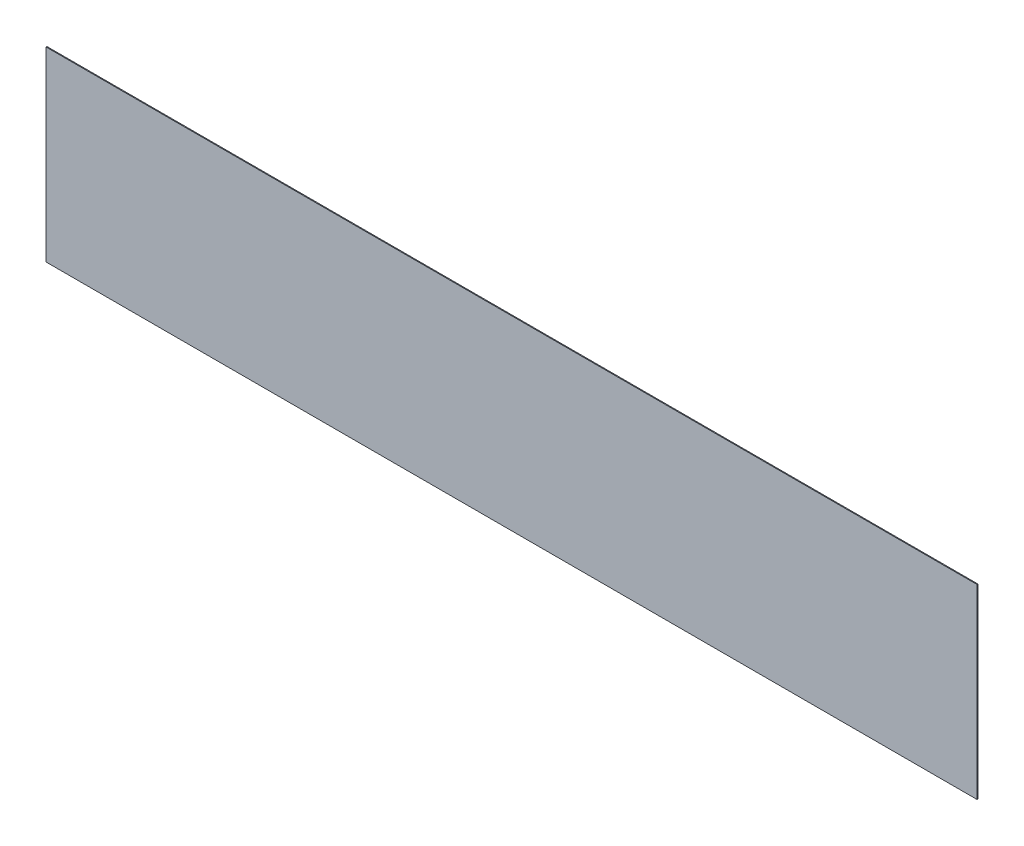
ISO-10303-21;
HEADER;
FILE_DESCRIPTION(('STEP AP214'),'2;1');
FILE_NAME('part.step','',(''),(''),'','','');
FILE_SCHEMA(('AUTOMOTIVE_DESIGN { 1 0 10303 214 1 1 1 1 }'));
ENDSEC;
DATA;
#1=APPLICATION_CONTEXT('core data for automotive mechanical design processes');
#2=APPLICATION_PROTOCOL_DEFINITION('international standard','automotive_design',2000,#1);
#3=PRODUCT_CONTEXT('',#1,'mechanical');
#4=PRODUCT('Part','Part','',(#3));
#5=PRODUCT_RELATED_PRODUCT_CATEGORY('part','',(#4));
#6=PRODUCT_DEFINITION_FORMATION('','',#4);
#7=PRODUCT_DEFINITION_CONTEXT('part definition',#1,'design');
#8=PRODUCT_DEFINITION('design','',#6,#7);
#9=PRODUCT_DEFINITION_SHAPE('','',#8);
#10=(LENGTH_UNIT() NAMED_UNIT(*) SI_UNIT(.MILLI.,.METRE.));
#11=(NAMED_UNIT(*) PLANE_ANGLE_UNIT() SI_UNIT($,.RADIAN.));
#12=(NAMED_UNIT(*) SI_UNIT($,.STERADIAN.) SOLID_ANGLE_UNIT());
#13=UNCERTAINTY_MEASURE_WITH_UNIT(LENGTH_MEASURE(1.E-05),#10,'distance_accuracy_value','');
#14=(GEOMETRIC_REPRESENTATION_CONTEXT(3) GLOBAL_UNCERTAINTY_ASSIGNED_CONTEXT((#13)) GLOBAL_UNIT_ASSIGNED_CONTEXT((#10,
#11,#12)) REPRESENTATION_CONTEXT('',''));
#15=CARTESIAN_POINT('',(0.,0.,0.));
#16=DIRECTION('',(0.,0.,1.));
#17=DIRECTION('',(1.,0.,0.));
#18=AXIS2_PLACEMENT_3D('',#15,#16,#17);
#19=CARTESIAN_POINT('',(139.996,16.,0.15));
#20=DIRECTION('',(0.,-1.,0.));
#21=DIRECTION('',(1.,0.,0.));
#22=AXIS2_PLACEMENT_3D('',#19,#20,#21);
#23=PLANE('',#22);
#24=DIRECTION('',(-1.,0.,0.));
#25=VECTOR('',#24,1.);
#26=CARTESIAN_POINT('',(139.996,16.,0.));
#27=LINE('',#26,#25);
#28=CARTESIAN_POINT('',(139.996,16.,0.));
#29=VERTEX_POINT('',#28);
#30=CARTESIAN_POINT('',(-20.,16.,0.));
#31=VERTEX_POINT('',#30);
#32=EDGE_CURVE('E100',#29,#31,#27,.T.);
#33=ORIENTED_EDGE('',*,*,#32,.T.);
#34=DIRECTION('',(0.,0.,-1.));
#35=VECTOR('',#34,1.);
#36=CARTESIAN_POINT('',(-20.,16.,0.15));
#37=LINE('',#36,#35);
#38=CARTESIAN_POINT('',(-20.,16.,0.15));
#39=VERTEX_POINT('',#38);
#40=EDGE_CURVE('E11',#39,#31,#37,.T.);
#41=ORIENTED_EDGE('',*,*,#40,.F.);
#42=DIRECTION('',(-1.,0.,0.));
#43=VECTOR('',#42,1.);
#44=CARTESIAN_POINT('',(139.996,16.,0.15));
#45=LINE('',#44,#43);
#46=CARTESIAN_POINT('',(139.996,16.,0.15));
#47=VERTEX_POINT('',#46);
#48=EDGE_CURVE('E88',#47,#39,#45,.T.);
#49=ORIENTED_EDGE('',*,*,#48,.F.);
#50=DIRECTION('',(0.,0.,-1.));
#51=VECTOR('',#50,1.);
#52=CARTESIAN_POINT('',(139.996,16.,0.15));
#53=LINE('',#52,#51);
#54=EDGE_CURVE('E96',#47,#29,#53,.T.);
#55=ORIENTED_EDGE('',*,*,#54,.T.);
#56=EDGE_LOOP('',(#33,#41,#49,#55));
#57=FACE_BOUND('',#56,.T.);
#58=ADVANCED_FACE('F37',(#57),#23,.F.);
#59=CARTESIAN_POINT('',(-20.,16.,0.15));
#60=DIRECTION('',(1.,0.,0.));
#61=DIRECTION('',(0.,0.,-1.));
#62=AXIS2_PLACEMENT_3D('',#59,#60,#61);
#63=PLANE('',#62);
#64=DIRECTION('',(0.,-1.,0.));
#65=VECTOR('',#64,1.);
#66=CARTESIAN_POINT('',(-20.,16.,0.));
#67=LINE('',#66,#65);
#68=CARTESIAN_POINT('',(-20.,-16.,0.));
#69=VERTEX_POINT('',#68);
#70=EDGE_CURVE('E92',#31,#69,#67,.T.);
#71=ORIENTED_EDGE('',*,*,#70,.T.);
#72=DIRECTION('',(0.,0.,-1.));
#73=VECTOR('',#72,1.);
#74=CARTESIAN_POINT('',(-20.,-16.,0.15));
#75=LINE('',#74,#73);
#76=CARTESIAN_POINT('',(-20.,-16.,0.15));
#77=VERTEX_POINT('',#76);
#78=EDGE_CURVE('E45',#77,#69,#75,.T.);
#79=ORIENTED_EDGE('',*,*,#78,.F.);
#80=DIRECTION('',(0.,-1.,0.));
#81=VECTOR('',#80,1.);
#82=CARTESIAN_POINT('',(-20.,16.,0.15));
#83=LINE('',#82,#81);
#84=EDGE_CURVE('E83',#39,#77,#83,.T.);
#85=ORIENTED_EDGE('',*,*,#84,.F.);
#86=ORIENTED_EDGE('',*,*,#40,.T.);
#87=EDGE_LOOP('',(#71,#79,#85,#86));
#88=FACE_BOUND('',#87,.T.);
#89=ADVANCED_FACE('F91',(#88),#63,.F.);
#90=CARTESIAN_POINT('',(-20.,-16.,0.15));
#91=DIRECTION('',(0.,1.,0.));
#92=DIRECTION('',(-1.,0.,0.));
#93=AXIS2_PLACEMENT_3D('',#90,#91,#92);
#94=PLANE('',#93);
#95=DIRECTION('',(1.,0.,0.));
#96=VECTOR('',#95,1.);
#97=CARTESIAN_POINT('',(-20.,-16.,0.));
#98=LINE('',#97,#96);
#99=CARTESIAN_POINT('',(139.996,-16.,0.));
#100=VERTEX_POINT('',#99);
#101=EDGE_CURVE('E70',#69,#100,#98,.T.);
#102=ORIENTED_EDGE('',*,*,#101,.T.);
#103=DIRECTION('',(0.,0.,-1.));
#104=VECTOR('',#103,1.);
#105=CARTESIAN_POINT('',(139.996,-16.,0.15));
#106=LINE('',#105,#104);
#107=CARTESIAN_POINT('',(139.996,-16.,0.15));
#108=VERTEX_POINT('',#107);
#109=EDGE_CURVE('E93',#108,#100,#106,.T.);
#110=ORIENTED_EDGE('',*,*,#109,.F.);
#111=DIRECTION('',(1.,0.,0.));
#112=VECTOR('',#111,1.);
#113=CARTESIAN_POINT('',(-20.,-16.,0.15));
#114=LINE('',#113,#112);
#115=EDGE_CURVE('E86',#77,#108,#114,.T.);
#116=ORIENTED_EDGE('',*,*,#115,.F.);
#117=ORIENTED_EDGE('',*,*,#78,.T.);
#118=EDGE_LOOP('',(#102,#110,#116,#117));
#119=FACE_BOUND('',#118,.T.);
#120=ADVANCED_FACE('F94',(#119),#94,.F.);
#121=CARTESIAN_POINT('',(139.996,-16.,0.15));
#122=DIRECTION('',(-1.,0.,0.));
#123=DIRECTION('',(0.,0.,1.));
#124=AXIS2_PLACEMENT_3D('',#121,#122,#123);
#125=PLANE('',#124);
#126=DIRECTION('',(0.,1.,0.));
#127=VECTOR('',#126,1.);
#128=CARTESIAN_POINT('',(139.996,-16.,0.));
#129=LINE('',#128,#127);
#130=EDGE_CURVE('E76',#100,#29,#129,.T.);
#131=ORIENTED_EDGE('',*,*,#130,.T.);
#132=ORIENTED_EDGE('',*,*,#54,.F.);
#133=DIRECTION('',(0.,1.,0.));
#134=VECTOR('',#133,1.);
#135=CARTESIAN_POINT('',(139.996,-16.,0.15));
#136=LINE('',#135,#134);
#137=EDGE_CURVE('E53',#108,#47,#136,.T.);
#138=ORIENTED_EDGE('',*,*,#137,.F.);
#139=ORIENTED_EDGE('',*,*,#109,.T.);
#140=EDGE_LOOP('',(#131,#132,#138,#139));
#141=FACE_BOUND('',#140,.T.);
#142=ADVANCED_FACE('F107',(#141),#125,.F.);
#143=CARTESIAN_POINT('',(0.,0.,0.15));
#144=DIRECTION('',(0.,0.,1.));
#145=DIRECTION('',(1.,0.,0.));
#146=AXIS2_PLACEMENT_3D('',#143,#144,#145);
#147=PLANE('',#146);
#148=ORIENTED_EDGE('',*,*,#48,.T.);
#149=ORIENTED_EDGE('',*,*,#84,.T.);
#150=ORIENTED_EDGE('',*,*,#115,.T.);
#151=ORIENTED_EDGE('',*,*,#137,.T.);
#152=EDGE_LOOP('',(#148,#149,#150,#151));
#153=FACE_BOUND('',#152,.T.);
#154=ADVANCED_FACE('F84',(#153),#147,.T.);
#155=CARTESIAN_POINT('',(0.,0.,0.));
#156=DIRECTION('',(0.,0.,1.));
#157=DIRECTION('',(1.,0.,0.));
#158=AXIS2_PLACEMENT_3D('',#155,#156,#157);
#159=PLANE('',#158);
#160=ORIENTED_EDGE('',*,*,#32,.F.);
#161=ORIENTED_EDGE('',*,*,#130,.F.);
#162=ORIENTED_EDGE('',*,*,#101,.F.);
#163=ORIENTED_EDGE('',*,*,#70,.F.);
#164=EDGE_LOOP('',(#160,#161,#162,#163));
#165=FACE_BOUND('',#164,.T.);
#166=ADVANCED_FACE('F110',(#165),#159,.F.);
#167=CLOSED_SHELL('',(#58,#89,#120,#142,#154,#166));
#168=MANIFOLD_SOLID_BREP('B2',#167);
#169=ADVANCED_BREP_SHAPE_REPRESENTATION('',(#18,#168),#14);
#170=SHAPE_DEFINITION_REPRESENTATION(#9,#169);
ENDSEC;
END-ISO-10303-21;
